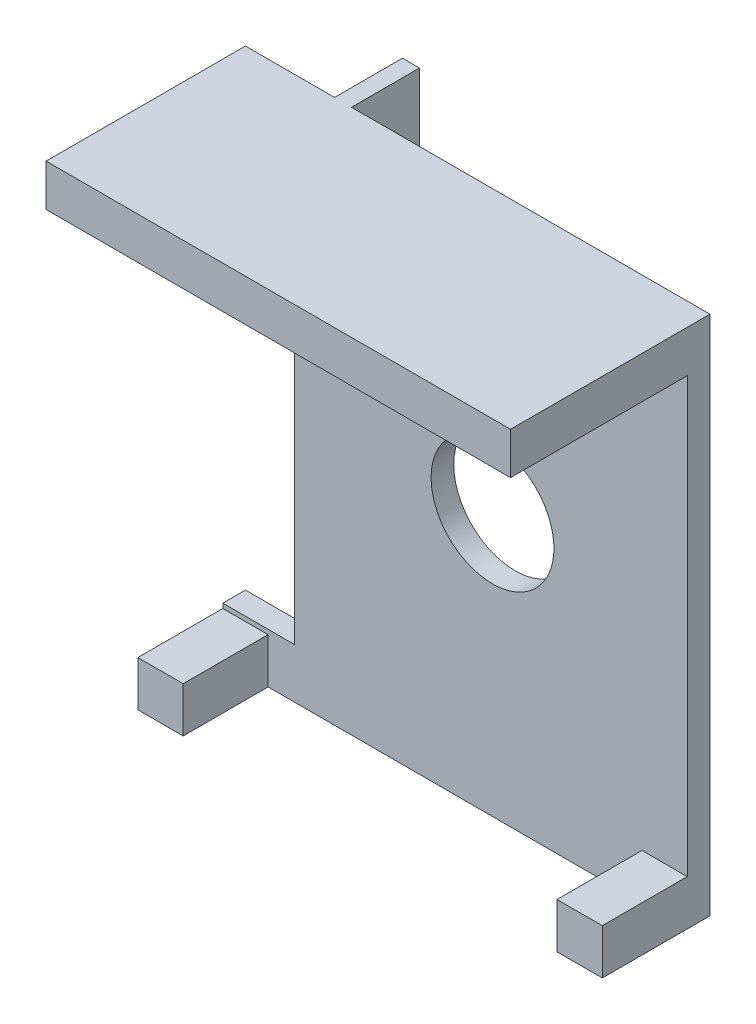
ISO-10303-21;
HEADER;
FILE_DESCRIPTION(('STEP AP214'),'2;1');
FILE_NAME('part.step','',(''),(''),'','','');
FILE_SCHEMA(('AUTOMOTIVE_DESIGN { 1 0 10303 214 1 1 1 1 }'));
ENDSEC;
DATA;
#1=APPLICATION_CONTEXT('core data for automotive mechanical design processes');
#2=APPLICATION_PROTOCOL_DEFINITION('international standard','automotive_design',2000,#1);
#3=PRODUCT_CONTEXT('',#1,'mechanical');
#4=PRODUCT('Part','Part','',(#3));
#5=PRODUCT_RELATED_PRODUCT_CATEGORY('part','',(#4));
#6=PRODUCT_DEFINITION_FORMATION('','',#4);
#7=PRODUCT_DEFINITION_CONTEXT('part definition',#1,'design');
#8=PRODUCT_DEFINITION('design','',#6,#7);
#9=PRODUCT_DEFINITION_SHAPE('','',#8);
#10=(LENGTH_UNIT() NAMED_UNIT(*) SI_UNIT(.MILLI.,.METRE.));
#11=(NAMED_UNIT(*) PLANE_ANGLE_UNIT() SI_UNIT($,.RADIAN.));
#12=(NAMED_UNIT(*) SI_UNIT($,.STERADIAN.) SOLID_ANGLE_UNIT());
#13=UNCERTAINTY_MEASURE_WITH_UNIT(LENGTH_MEASURE(1.E-05),#10,'distance_accuracy_value','');
#14=(GEOMETRIC_REPRESENTATION_CONTEXT(3) GLOBAL_UNCERTAINTY_ASSIGNED_CONTEXT((#13)) GLOBAL_UNIT_ASSIGNED_CONTEXT((#10,
#11,#12)) REPRESENTATION_CONTEXT('',''));
#15=CARTESIAN_POINT('',(0.,0.,0.));
#16=DIRECTION('',(0.,0.,1.));
#17=DIRECTION('',(1.,0.,0.));
#18=AXIS2_PLACEMENT_3D('',#15,#16,#17);
#19=CARTESIAN_POINT('',(0.,0.,2.));
#20=DIRECTION('',(1.,0.,0.));
#21=DIRECTION('',(0.,0.,-1.));
#22=AXIS2_PLACEMENT_3D('',#19,#20,#21);
#23=PLANE('',#22);
#24=DIRECTION('',(0.,-1.,0.));
#25=VECTOR('',#24,1.);
#26=CARTESIAN_POINT('',(0.,0.,2.));
#27=LINE('',#26,#25);
#28=CARTESIAN_POINT('',(0.,4.4080337669324,2.));
#29=VERTEX_POINT('',#28);
#30=CARTESIAN_POINT('',(0.,4.,2.));
#31=VERTEX_POINT('',#30);
#32=EDGE_CURVE('E343',#29,#31,#27,.T.);
#33=ORIENTED_EDGE('',*,*,#32,.F.);
#34=DIRECTION('',(0.,0.,-1.));
#35=VECTOR('',#34,1.);
#36=CARTESIAN_POINT('',(0.,4.4080337669324,2.));
#37=LINE('',#36,#35);
#38=CARTESIAN_POINT('',(0.,4.4080337669324,0.));
#39=VERTEX_POINT('',#38);
#40=EDGE_CURVE('E231',#29,#39,#37,.T.);
#41=ORIENTED_EDGE('',*,*,#40,.T.);
#42=DIRECTION('',(0.,-1.,0.));
#43=VECTOR('',#42,1.);
#44=CARTESIAN_POINT('',(0.,0.,0.));
#45=LINE('',#44,#43);
#46=CARTESIAN_POINT('',(0.,0.,0.));
#47=VERTEX_POINT('',#46);
#48=EDGE_CURVE('E337',#39,#47,#45,.T.);
#49=ORIENTED_EDGE('',*,*,#48,.T.);
#50=DIRECTION('',(0.,0.,-1.));
#51=VECTOR('',#50,1.);
#52=CARTESIAN_POINT('',(0.,0.,2.));
#53=LINE('',#52,#51);
#54=CARTESIAN_POINT('',(0.,0.,9.5));
#55=VERTEX_POINT('',#54);
#56=EDGE_CURVE('E11',#55,#47,#53,.T.);
#57=ORIENTED_EDGE('',*,*,#56,.F.);
#58=DIRECTION('',(0.,-1.,0.));
#59=VECTOR('',#58,1.);
#60=CARTESIAN_POINT('',(0.,0.,9.5));
#61=LINE('',#60,#59);
#62=CARTESIAN_POINT('',(0.,4.,9.5));
#63=VERTEX_POINT('',#62);
#64=EDGE_CURVE('E305',#63,#55,#61,.T.);
#65=ORIENTED_EDGE('',*,*,#64,.F.);
#66=DIRECTION('',(0.,0.,-1.));
#67=VECTOR('',#66,1.);
#68=CARTESIAN_POINT('',(0.,4.,9.5));
#69=LINE('',#68,#67);
#70=EDGE_CURVE('E319',#63,#31,#69,.T.);
#71=ORIENTED_EDGE('',*,*,#70,.T.);
#72=EDGE_LOOP('',(#33,#41,#49,#57,#65,#71));
#73=FACE_BOUND('',#72,.T.);
#74=ADVANCED_FACE('F38',(#73),#23,.F.);
#75=CARTESIAN_POINT('',(0.,0.,2.));
#76=DIRECTION('',(0.,0.,-1.));
#77=DIRECTION('',(-1.,0.,0.));
#78=AXIS2_PLACEMENT_3D('',#75,#76,#77);
#79=PLANE('',#78);
#80=CARTESIAN_POINT('',(23.8073986,23.20549075,2.));
#81=DIRECTION('',(0.,0.,-1.));
#82=DIRECTION('',(-1.,0.,0.));
#83=AXIS2_PLACEMENT_3D('',#80,#81,#82);
#84=CIRCLE('',#83,5.42197310937778);
#85=CARTESIAN_POINT('',(18.3854254906222,23.20549075,2.));
#86=VERTEX_POINT('',#85);
#87=EDGE_CURVE('E399',#86,#86,#84,.T.);
#88=ORIENTED_EDGE('',*,*,#87,.T.);
#89=EDGE_LOOP('',(#88));
#90=FACE_BOUND('',#89,.T.);
#91=DIRECTION('',(0.,-1.,0.));
#92=VECTOR('',#91,1.);
#93=CARTESIAN_POINT('',(6.31568334551957,38.749493626522,2.));
#94=LINE('',#93,#92);
#95=CARTESIAN_POINT('',(6.31568334551957,38.749493626522,2.));
#96=VERTEX_POINT('',#95);
#97=CARTESIAN_POINT('',(6.31568334551957,4.4080337669324,2.));
#98=VERTEX_POINT('',#97);
#99=EDGE_CURVE('E216',#96,#98,#94,.T.);
#100=ORIENTED_EDGE('',*,*,#99,.T.);
#101=DIRECTION('',(-1.,0.,0.));
#102=VECTOR('',#101,1.);
#103=CARTESIAN_POINT('',(0.,4.4080337669324,2.));
#104=LINE('',#103,#102);
#105=EDGE_CURVE('E221',#98,#29,#104,.T.);
#106=ORIENTED_EDGE('',*,*,#105,.T.);
#107=ORIENTED_EDGE('',*,*,#32,.T.);
#108=DIRECTION('',(-1.,0.,0.));
#109=VECTOR('',#108,1.);
#110=CARTESIAN_POINT('',(0.,4.,2.));
#111=LINE('',#110,#109);
#112=CARTESIAN_POINT('',(4.,4.,2.));
#113=VERTEX_POINT('',#112);
#114=EDGE_CURVE('E310',#113,#31,#111,.T.);
#115=ORIENTED_EDGE('',*,*,#114,.F.);
#116=DIRECTION('',(0.,1.,0.));
#117=VECTOR('',#116,1.);
#118=CARTESIAN_POINT('',(4.,0.,2.));
#119=LINE('',#118,#117);
#120=CARTESIAN_POINT('',(4.,0.,2.));
#121=VERTEX_POINT('',#120);
#122=EDGE_CURVE('E304',#121,#113,#119,.T.);
#123=ORIENTED_EDGE('',*,*,#122,.F.);
#124=DIRECTION('',(1.,0.,0.));
#125=VECTOR('',#124,1.);
#126=CARTESIAN_POINT('',(0.,0.,2.));
#127=LINE('',#126,#125);
#128=CARTESIAN_POINT('',(37.,0.,2.));
#129=VERTEX_POINT('',#128);
#130=EDGE_CURVE('E342',#121,#129,#127,.T.);
#131=ORIENTED_EDGE('',*,*,#130,.T.);
#132=DIRECTION('',(0.,-1.,0.));
#133=VECTOR('',#132,1.);
#134=CARTESIAN_POINT('',(37.,0.,2.));
#135=LINE('',#134,#133);
#136=CARTESIAN_POINT('',(37.,4.,2.));
#137=VERTEX_POINT('',#136);
#138=EDGE_CURVE('E276',#137,#129,#135,.T.);
#139=ORIENTED_EDGE('',*,*,#138,.F.);
#140=DIRECTION('',(-1.,0.,0.));
#141=VECTOR('',#140,1.);
#142=CARTESIAN_POINT('',(41.,4.,2.));
#143=LINE('',#142,#141);
#144=CARTESIAN_POINT('',(41.,4.,2.));
#145=VERTEX_POINT('',#144);
#146=EDGE_CURVE('E270',#145,#137,#143,.T.);
#147=ORIENTED_EDGE('',*,*,#146,.F.);
#148=DIRECTION('',(0.,1.,0.));
#149=VECTOR('',#148,1.);
#150=CARTESIAN_POINT('',(41.,0.,2.));
#151=LINE('',#150,#149);
#152=CARTESIAN_POINT('',(41.,42.3,2.));
#153=VERTEX_POINT('',#152);
#154=EDGE_CURVE('E346',#145,#153,#151,.T.);
#155=ORIENTED_EDGE('',*,*,#154,.T.);
#156=DIRECTION('',(1.,0.,0.));
#157=VECTOR('',#156,1.);
#158=CARTESIAN_POINT('',(0.,42.3,2.));
#159=LINE('',#158,#157);
#160=CARTESIAN_POINT('',(0.,42.3,2.));
#161=VERTEX_POINT('',#160);
#162=EDGE_CURVE('E235',#161,#153,#159,.T.);
#163=ORIENTED_EDGE('',*,*,#162,.F.);
#164=CARTESIAN_POINT('',(0.,38.749493626522,2.));
#165=VERTEX_POINT('',#164);
#166=EDGE_CURVE('E338',#161,#165,#27,.T.);
#167=ORIENTED_EDGE('',*,*,#166,.T.);
#168=DIRECTION('',(1.,0.,0.));
#169=VECTOR('',#168,1.);
#170=CARTESIAN_POINT('',(0.,38.749493626522,2.));
#171=LINE('',#170,#169);
#172=EDGE_CURVE('E212',#165,#96,#171,.T.);
#173=ORIENTED_EDGE('',*,*,#172,.T.);
#174=EDGE_LOOP('',(#100,#106,#107,#115,#123,#131,#139,#147,#155,#163,#167,#173));
#175=FACE_BOUND('',#174,.T.);
#176=ADVANCED_FACE('F411',(#90,#175),#79,.F.);
#177=CARTESIAN_POINT('',(0.,46.,0.));
#178=VERTEX_POINT('',#177);
#179=CARTESIAN_POINT('',(0.,38.749493626522,0.));
#180=VERTEX_POINT('',#179);
#181=EDGE_CURVE('E350',#178,#180,#45,.T.);
#182=ORIENTED_EDGE('',*,*,#181,.T.);
#183=DIRECTION('',(0.,0.,-1.));
#184=VECTOR('',#183,1.);
#185=CARTESIAN_POINT('',(0.,38.749493626522,2.));
#186=LINE('',#185,#184);
#187=EDGE_CURVE('E224',#165,#180,#186,.T.);
#188=ORIENTED_EDGE('',*,*,#187,.F.);
#189=ORIENTED_EDGE('',*,*,#166,.F.);
#190=DIRECTION('',(0.,0.,-1.));
#191=VECTOR('',#190,1.);
#192=CARTESIAN_POINT('',(0.,42.3,17.6));
#193=LINE('',#192,#191);
#194=CARTESIAN_POINT('',(0.,42.3,17.6));
#195=VERTEX_POINT('',#194);
#196=EDGE_CURVE('E266',#195,#161,#193,.T.);
#197=ORIENTED_EDGE('',*,*,#196,.F.);
#198=DIRECTION('',(0.,-1.,0.));
#199=VECTOR('',#198,1.);
#200=CARTESIAN_POINT('',(0.,46.,17.6));
#201=LINE('',#200,#199);
#202=CARTESIAN_POINT('',(0.,46.,17.6));
#203=VERTEX_POINT('',#202);
#204=EDGE_CURVE('E244',#203,#195,#201,.T.);
#205=ORIENTED_EDGE('',*,*,#204,.F.);
#206=DIRECTION('',(0.,0.,-1.));
#207=VECTOR('',#206,1.);
#208=CARTESIAN_POINT('',(0.,46.,2.));
#209=LINE('',#208,#207);
#210=EDGE_CURVE('E349',#203,#178,#209,.T.);
#211=ORIENTED_EDGE('',*,*,#210,.T.);
#212=EDGE_LOOP('',(#182,#188,#189,#197,#205,#211));
#213=FACE_BOUND('',#212,.T.);
#214=ADVANCED_FACE('F40',(#213),#23,.F.);
#215=CARTESIAN_POINT('',(0.,0.,2.));
#216=DIRECTION('',(0.,1.,0.));
#217=DIRECTION('',(0.,0.,1.));
#218=AXIS2_PLACEMENT_3D('',#215,#216,#217);
#219=PLANE('',#218);
#220=DIRECTION('',(1.,0.,0.));
#221=VECTOR('',#220,1.);
#222=CARTESIAN_POINT('',(0.,0.,0.));
#223=LINE('',#222,#221);
#224=CARTESIAN_POINT('',(41.,0.,0.));
#225=VERTEX_POINT('',#224);
#226=EDGE_CURVE('E354',#47,#225,#223,.T.);
#227=ORIENTED_EDGE('',*,*,#226,.T.);
#228=DIRECTION('',(0.,0.,-1.));
#229=VECTOR('',#228,1.);
#230=CARTESIAN_POINT('',(41.,0.,2.));
#231=LINE('',#230,#229);
#232=CARTESIAN_POINT('',(41.,0.,9.5));
#233=VERTEX_POINT('',#232);
#234=EDGE_CURVE('E47',#233,#225,#231,.T.);
#235=ORIENTED_EDGE('',*,*,#234,.F.);
#236=DIRECTION('',(1.,0.,0.));
#237=VECTOR('',#236,1.);
#238=CARTESIAN_POINT('',(41.,0.,9.5));
#239=LINE('',#238,#237);
#240=CARTESIAN_POINT('',(37.,0.,9.5));
#241=VERTEX_POINT('',#240);
#242=EDGE_CURVE('E282',#241,#233,#239,.T.);
#243=ORIENTED_EDGE('',*,*,#242,.F.);
#244=DIRECTION('',(0.,0.,-1.));
#245=VECTOR('',#244,1.);
#246=CARTESIAN_POINT('',(37.,0.,9.5));
#247=LINE('',#246,#245);
#248=EDGE_CURVE('E286',#241,#129,#247,.T.);
#249=ORIENTED_EDGE('',*,*,#248,.T.);
#250=ORIENTED_EDGE('',*,*,#130,.F.);
#251=DIRECTION('',(0.,0.,-1.));
#252=VECTOR('',#251,1.);
#253=CARTESIAN_POINT('',(4.,0.,9.5));
#254=LINE('',#253,#252);
#255=CARTESIAN_POINT('',(4.,0.,9.5));
#256=VERTEX_POINT('',#255);
#257=EDGE_CURVE('E333',#256,#121,#254,.T.);
#258=ORIENTED_EDGE('',*,*,#257,.F.);
#259=DIRECTION('',(1.,0.,0.));
#260=VECTOR('',#259,1.);
#261=CARTESIAN_POINT('',(0.,0.,9.5));
#262=LINE('',#261,#260);
#263=EDGE_CURVE('E309',#55,#256,#262,.T.);
#264=ORIENTED_EDGE('',*,*,#263,.F.);
#265=ORIENTED_EDGE('',*,*,#56,.T.);
#266=EDGE_LOOP('',(#227,#235,#243,#249,#250,#258,#264,#265));
#267=FACE_BOUND('',#266,.T.);
#268=ADVANCED_FACE('F441',(#267),#219,.F.);
#269=CARTESIAN_POINT('',(41.,0.,2.));
#270=DIRECTION('',(-1.,0.,0.));
#271=DIRECTION('',(0.,0.,1.));
#272=AXIS2_PLACEMENT_3D('',#269,#270,#271);
#273=PLANE('',#272);
#274=DIRECTION('',(0.,1.,0.));
#275=VECTOR('',#274,1.);
#276=CARTESIAN_POINT('',(41.,0.,0.));
#277=LINE('',#276,#275);
#278=CARTESIAN_POINT('',(41.,46.,0.));
#279=VERTEX_POINT('',#278);
#280=EDGE_CURVE('E357',#225,#279,#277,.T.);
#281=ORIENTED_EDGE('',*,*,#280,.T.);
#282=DIRECTION('',(0.,0.,-1.));
#283=VECTOR('',#282,1.);
#284=CARTESIAN_POINT('',(41.,46.,2.));
#285=LINE('',#284,#283);
#286=CARTESIAN_POINT('',(41.,46.,17.6));
#287=VERTEX_POINT('',#286);
#288=EDGE_CURVE('E367',#287,#279,#285,.T.);
#289=ORIENTED_EDGE('',*,*,#288,.F.);
#290=DIRECTION('',(0.,1.,0.));
#291=VECTOR('',#290,1.);
#292=CARTESIAN_POINT('',(41.,46.,17.6));
#293=LINE('',#292,#291);
#294=CARTESIAN_POINT('',(41.,42.3,17.6));
#295=VERTEX_POINT('',#294);
#296=EDGE_CURVE('E251',#295,#287,#293,.T.);
#297=ORIENTED_EDGE('',*,*,#296,.F.);
#298=DIRECTION('',(0.,0.,-1.));
#299=VECTOR('',#298,1.);
#300=CARTESIAN_POINT('',(41.,42.3,17.6));
#301=LINE('',#300,#299);
#302=EDGE_CURVE('E259',#295,#153,#301,.T.);
#303=ORIENTED_EDGE('',*,*,#302,.T.);
#304=ORIENTED_EDGE('',*,*,#154,.F.);
#305=DIRECTION('',(0.,0.,-1.));
#306=VECTOR('',#305,1.);
#307=CARTESIAN_POINT('',(41.,4.,9.5));
#308=LINE('',#307,#306);
#309=CARTESIAN_POINT('',(41.,4.,9.5));
#310=VERTEX_POINT('',#309);
#311=EDGE_CURVE('E300',#310,#145,#308,.T.);
#312=ORIENTED_EDGE('',*,*,#311,.F.);
#313=DIRECTION('',(0.,1.,0.));
#314=VECTOR('',#313,1.);
#315=CARTESIAN_POINT('',(41.,0.,9.5));
#316=LINE('',#315,#314);
#317=EDGE_CURVE('E271',#233,#310,#316,.T.);
#318=ORIENTED_EDGE('',*,*,#317,.F.);
#319=ORIENTED_EDGE('',*,*,#234,.T.);
#320=EDGE_LOOP('',(#281,#289,#297,#303,#304,#312,#318,#319));
#321=FACE_BOUND('',#320,.T.);
#322=ADVANCED_FACE('F375',(#321),#273,.F.);
#323=CARTESIAN_POINT('',(0.,46.,2.));
#324=DIRECTION('',(0.,-1.,0.));
#325=DIRECTION('',(0.,0.,-1.));
#326=AXIS2_PLACEMENT_3D('',#323,#324,#325);
#327=PLANE('',#326);
#328=DIRECTION('',(-1.,0.,0.));
#329=VECTOR('',#328,1.);
#330=CARTESIAN_POINT('',(0.,46.,0.));
#331=LINE('',#330,#329);
#332=CARTESIAN_POINT('',(9.36150105812317,46.,0.));
#333=VERTEX_POINT('',#332);
#334=EDGE_CURVE('E360',#279,#333,#331,.T.);
#335=ORIENTED_EDGE('',*,*,#334,.T.);
#336=DIRECTION('',(0.,0.,1.));
#337=VECTOR('',#336,1.);
#338=CARTESIAN_POINT('',(9.36150105812317,46.,-6.));
#339=LINE('',#338,#337);
#340=CARTESIAN_POINT('',(9.36150105812317,46.,-6.));
#341=VERTEX_POINT('',#340);
#342=EDGE_CURVE('E385',#341,#333,#339,.T.);
#343=ORIENTED_EDGE('',*,*,#342,.F.);
#344=DIRECTION('',(1.,0.,0.));
#345=VECTOR('',#344,1.);
#346=CARTESIAN_POINT('',(9.36150105812317,46.,-6.));
#347=LINE('',#346,#345);
#348=CARTESIAN_POINT('',(7.86150105812317,46.,-6.));
#349=VERTEX_POINT('',#348);
#350=EDGE_CURVE('E191',#349,#341,#347,.T.);
#351=ORIENTED_EDGE('',*,*,#350,.F.);
#352=DIRECTION('',(0.,0.,1.));
#353=VECTOR('',#352,1.);
#354=CARTESIAN_POINT('',(7.86150105812317,46.,-6.));
#355=LINE('',#354,#353);
#356=CARTESIAN_POINT('',(7.86150105812317,46.,0.));
#357=VERTEX_POINT('',#356);
#358=EDGE_CURVE('E208',#349,#357,#355,.T.);
#359=ORIENTED_EDGE('',*,*,#358,.T.);
#360=EDGE_CURVE('E60',#357,#178,#331,.T.);
#361=ORIENTED_EDGE('',*,*,#360,.T.);
#362=ORIENTED_EDGE('',*,*,#210,.F.);
#363=DIRECTION('',(-1.,0.,0.));
#364=VECTOR('',#363,1.);
#365=CARTESIAN_POINT('',(0.,46.,17.6));
#366=LINE('',#365,#364);
#367=EDGE_CURVE('E255',#287,#203,#366,.T.);
#368=ORIENTED_EDGE('',*,*,#367,.F.);
#369=ORIENTED_EDGE('',*,*,#288,.T.);
#370=EDGE_LOOP('',(#335,#343,#351,#359,#361,#362,#368,#369));
#371=FACE_BOUND('',#370,.T.);
#372=ADVANCED_FACE('F384',(#371),#327,.F.);
#373=CARTESIAN_POINT('',(0.,0.,0.));
#374=DIRECTION('',(0.,0.,-1.));
#375=DIRECTION('',(-1.,0.,0.));
#376=AXIS2_PLACEMENT_3D('',#373,#374,#375);
#377=PLANE('',#376);
#378=CARTESIAN_POINT('',(23.8073986,23.20549075,0.));
#379=DIRECTION('',(0.,0.,-1.));
#380=DIRECTION('',(-1.,0.,0.));
#381=AXIS2_PLACEMENT_3D('',#378,#379,#380);
#382=CIRCLE('',#381,5.42197310937778);
#383=CARTESIAN_POINT('',(18.3854254906222,23.20549075,0.));
#384=VERTEX_POINT('',#383);
#385=EDGE_CURVE('E403',#384,#384,#382,.T.);
#386=ORIENTED_EDGE('',*,*,#385,.F.);
#387=EDGE_LOOP('',(#386));
#388=FACE_BOUND('',#387,.T.);
#389=DIRECTION('',(0.,-1.,0.));
#390=VECTOR('',#389,1.);
#391=CARTESIAN_POINT('',(9.36150105812317,46.,0.));
#392=LINE('',#391,#390);
#393=CARTESIAN_POINT('',(9.36150105812317,32.,0.));
#394=VERTEX_POINT('',#393);
#395=EDGE_CURVE('E199',#333,#394,#392,.T.);
#396=ORIENTED_EDGE('',*,*,#395,.F.);
#397=ORIENTED_EDGE('',*,*,#334,.F.);
#398=ORIENTED_EDGE('',*,*,#280,.F.);
#399=ORIENTED_EDGE('',*,*,#226,.F.);
#400=ORIENTED_EDGE('',*,*,#48,.F.);
#401=DIRECTION('',(-1.,0.,0.));
#402=VECTOR('',#401,1.);
#403=CARTESIAN_POINT('',(0.,4.4080337669324,0.));
#404=LINE('',#403,#402);
#405=CARTESIAN_POINT('',(6.31568334551957,4.4080337669324,0.));
#406=VERTEX_POINT('',#405);
#407=EDGE_CURVE('E217',#406,#39,#404,.T.);
#408=ORIENTED_EDGE('',*,*,#407,.F.);
#409=DIRECTION('',(0.,-1.,0.));
#410=VECTOR('',#409,1.);
#411=CARTESIAN_POINT('',(6.31568334551957,38.749493626522,0.));
#412=LINE('',#411,#410);
#413=CARTESIAN_POINT('',(6.31568334551957,38.749493626522,0.));
#414=VERTEX_POINT('',#413);
#415=EDGE_CURVE('E206',#414,#406,#412,.T.);
#416=ORIENTED_EDGE('',*,*,#415,.F.);
#417=DIRECTION('',(1.,0.,0.));
#418=VECTOR('',#417,1.);
#419=CARTESIAN_POINT('',(0.,38.749493626522,0.));
#420=LINE('',#419,#418);
#421=EDGE_CURVE('E201',#180,#414,#420,.T.);
#422=ORIENTED_EDGE('',*,*,#421,.F.);
#423=ORIENTED_EDGE('',*,*,#181,.F.);
#424=ORIENTED_EDGE('',*,*,#360,.F.);
#425=DIRECTION('',(0.,1.,0.));
#426=VECTOR('',#425,1.);
#427=CARTESIAN_POINT('',(7.86150105812317,46.,0.));
#428=LINE('',#427,#426);
#429=CARTESIAN_POINT('',(7.86150105812317,32.,0.));
#430=VERTEX_POINT('',#429);
#431=EDGE_CURVE('E196',#430,#357,#428,.T.);
#432=ORIENTED_EDGE('',*,*,#431,.F.);
#433=DIRECTION('',(-1.,0.,0.));
#434=VECTOR('',#433,1.);
#435=CARTESIAN_POINT('',(9.36150105812317,32.,0.));
#436=LINE('',#435,#434);
#437=EDGE_CURVE('E54',#394,#430,#436,.T.);
#438=ORIENTED_EDGE('',*,*,#437,.F.);
#439=EDGE_LOOP('',(#396,#397,#398,#399,#400,#408,#416,#422,#423,#424,#432,#438));
#440=FACE_BOUND('',#439,.T.);
#441=ADVANCED_FACE('F381',(#388,#440),#377,.T.);
#442=CARTESIAN_POINT('',(4.,0.,9.5));
#443=DIRECTION('',(-1.,0.,0.));
#444=DIRECTION('',(0.,-1.,0.));
#445=AXIS2_PLACEMENT_3D('',#442,#443,#444);
#446=PLANE('',#445);
#447=ORIENTED_EDGE('',*,*,#122,.T.);
#448=DIRECTION('',(0.,0.,-1.));
#449=VECTOR('',#448,1.);
#450=CARTESIAN_POINT('',(4.,4.,9.5));
#451=LINE('',#450,#449);
#452=CARTESIAN_POINT('',(4.,4.,9.5));
#453=VERTEX_POINT('',#452);
#454=EDGE_CURVE('E329',#453,#113,#451,.T.);
#455=ORIENTED_EDGE('',*,*,#454,.F.);
#456=DIRECTION('',(0.,1.,0.));
#457=VECTOR('',#456,1.);
#458=CARTESIAN_POINT('',(4.,0.,9.5));
#459=LINE('',#458,#457);
#460=EDGE_CURVE('E313',#256,#453,#459,.T.);
#461=ORIENTED_EDGE('',*,*,#460,.F.);
#462=ORIENTED_EDGE('',*,*,#257,.T.);
#463=EDGE_LOOP('',(#447,#455,#461,#462));
#464=FACE_BOUND('',#463,.T.);
#465=ADVANCED_FACE('F421',(#464),#446,.F.);
#466=CARTESIAN_POINT('',(0.,4.,9.5));
#467=DIRECTION('',(0.,-1.,0.));
#468=DIRECTION('',(0.,0.,-1.));
#469=AXIS2_PLACEMENT_3D('',#466,#467,#468);
#470=PLANE('',#469);
#471=ORIENTED_EDGE('',*,*,#114,.T.);
#472=ORIENTED_EDGE('',*,*,#70,.F.);
#473=DIRECTION('',(-1.,0.,0.));
#474=VECTOR('',#473,1.);
#475=CARTESIAN_POINT('',(0.,4.,9.5));
#476=LINE('',#475,#474);
#477=EDGE_CURVE('E316',#453,#63,#476,.T.);
#478=ORIENTED_EDGE('',*,*,#477,.F.);
#479=ORIENTED_EDGE('',*,*,#454,.T.);
#480=EDGE_LOOP('',(#471,#472,#478,#479));
#481=FACE_BOUND('',#480,.T.);
#482=ADVANCED_FACE('F428',(#481),#470,.F.);
#483=CARTESIAN_POINT('',(0.,0.,9.5));
#484=DIRECTION('',(0.,0.,-1.));
#485=DIRECTION('',(-1.,0.,0.));
#486=AXIS2_PLACEMENT_3D('',#483,#484,#485);
#487=PLANE('',#486);
#488=ORIENTED_EDGE('',*,*,#64,.T.);
#489=ORIENTED_EDGE('',*,*,#263,.T.);
#490=ORIENTED_EDGE('',*,*,#460,.T.);
#491=ORIENTED_EDGE('',*,*,#477,.T.);
#492=EDGE_LOOP('',(#488,#489,#490,#491));
#493=FACE_BOUND('',#492,.T.);
#494=ADVANCED_FACE('F498',(#493),#487,.F.);
#495=CARTESIAN_POINT('',(41.,4.,9.5));
#496=DIRECTION('',(0.,-1.,0.));
#497=DIRECTION('',(1.,0.,0.));
#498=AXIS2_PLACEMENT_3D('',#495,#496,#497);
#499=PLANE('',#498);
#500=ORIENTED_EDGE('',*,*,#146,.T.);
#501=DIRECTION('',(0.,0.,-1.));
#502=VECTOR('',#501,1.);
#503=CARTESIAN_POINT('',(37.,4.,9.5));
#504=LINE('',#503,#502);
#505=CARTESIAN_POINT('',(37.,4.,9.5));
#506=VERTEX_POINT('',#505);
#507=EDGE_CURVE('E296',#506,#137,#504,.T.);
#508=ORIENTED_EDGE('',*,*,#507,.F.);
#509=DIRECTION('',(-1.,0.,0.));
#510=VECTOR('',#509,1.);
#511=CARTESIAN_POINT('',(41.,4.,9.5));
#512=LINE('',#511,#510);
#513=EDGE_CURVE('E275',#310,#506,#512,.T.);
#514=ORIENTED_EDGE('',*,*,#513,.F.);
#515=ORIENTED_EDGE('',*,*,#311,.T.);
#516=EDGE_LOOP('',(#500,#508,#514,#515));
#517=FACE_BOUND('',#516,.T.);
#518=ADVANCED_FACE('F494',(#517),#499,.F.);
#519=CARTESIAN_POINT('',(37.,0.,9.5));
#520=DIRECTION('',(1.,0.,0.));
#521=DIRECTION('',(0.,0.,-1.));
#522=AXIS2_PLACEMENT_3D('',#519,#520,#521);
#523=PLANE('',#522);
#524=ORIENTED_EDGE('',*,*,#138,.T.);
#525=ORIENTED_EDGE('',*,*,#248,.F.);
#526=DIRECTION('',(0.,-1.,0.));
#527=VECTOR('',#526,1.);
#528=CARTESIAN_POINT('',(37.,0.,9.5));
#529=LINE('',#528,#527);
#530=EDGE_CURVE('E279',#506,#241,#529,.T.);
#531=ORIENTED_EDGE('',*,*,#530,.F.);
#532=ORIENTED_EDGE('',*,*,#507,.T.);
#533=EDGE_LOOP('',(#524,#525,#531,#532));
#534=FACE_BOUND('',#533,.T.);
#535=ADVANCED_FACE('F490',(#534),#523,.F.);
#536=CARTESIAN_POINT('',(0.,0.,9.5));
#537=DIRECTION('',(0.,0.,1.));
#538=DIRECTION('',(1.,0.,0.));
#539=AXIS2_PLACEMENT_3D('',#536,#537,#538);
#540=PLANE('',#539);
#541=ORIENTED_EDGE('',*,*,#317,.T.);
#542=ORIENTED_EDGE('',*,*,#513,.T.);
#543=ORIENTED_EDGE('',*,*,#530,.T.);
#544=ORIENTED_EDGE('',*,*,#242,.T.);
#545=EDGE_LOOP('',(#541,#542,#543,#544));
#546=FACE_BOUND('',#545,.T.);
#547=ADVANCED_FACE('F487',(#546),#540,.T.);
#548=CARTESIAN_POINT('',(0.,42.3,17.6));
#549=DIRECTION('',(0.,1.,0.));
#550=DIRECTION('',(-1.,0.,0.));
#551=AXIS2_PLACEMENT_3D('',#548,#549,#550);
#552=PLANE('',#551);
#553=ORIENTED_EDGE('',*,*,#162,.T.);
#554=ORIENTED_EDGE('',*,*,#302,.F.);
#555=DIRECTION('',(1.,0.,0.));
#556=VECTOR('',#555,1.);
#557=CARTESIAN_POINT('',(0.,42.3,17.6));
#558=LINE('',#557,#556);
#559=EDGE_CURVE('E248',#195,#295,#558,.T.);
#560=ORIENTED_EDGE('',*,*,#559,.F.);
#561=ORIENTED_EDGE('',*,*,#196,.T.);
#562=EDGE_LOOP('',(#553,#554,#560,#561));
#563=FACE_BOUND('',#562,.T.);
#564=ADVANCED_FACE('F457',(#563),#552,.F.);
#565=CARTESIAN_POINT('',(0.,0.,17.6));
#566=DIRECTION('',(0.,0.,1.));
#567=DIRECTION('',(1.,0.,0.));
#568=AXIS2_PLACEMENT_3D('',#565,#566,#567);
#569=PLANE('',#568);
#570=ORIENTED_EDGE('',*,*,#204,.T.);
#571=ORIENTED_EDGE('',*,*,#559,.T.);
#572=ORIENTED_EDGE('',*,*,#296,.T.);
#573=ORIENTED_EDGE('',*,*,#367,.T.);
#574=EDGE_LOOP('',(#570,#571,#572,#573));
#575=FACE_BOUND('',#574,.T.);
#576=ADVANCED_FACE('F461',(#575),#569,.T.);
#577=CARTESIAN_POINT('',(0.,4.4080337669324,2.));
#578=DIRECTION('',(0.,-1.,0.));
#579=DIRECTION('',(1.,0.,0.));
#580=AXIS2_PLACEMENT_3D('',#577,#578,#579);
#581=PLANE('',#580);
#582=ORIENTED_EDGE('',*,*,#407,.T.);
#583=ORIENTED_EDGE('',*,*,#40,.F.);
#584=ORIENTED_EDGE('',*,*,#105,.F.);
#585=DIRECTION('',(0.,0.,-1.));
#586=VECTOR('',#585,1.);
#587=CARTESIAN_POINT('',(6.31568334551957,4.4080337669324,2.));
#588=LINE('',#587,#586);
#589=EDGE_CURVE('E236',#98,#406,#588,.T.);
#590=ORIENTED_EDGE('',*,*,#589,.T.);
#591=EDGE_LOOP('',(#582,#583,#584,#590));
#592=FACE_BOUND('',#591,.T.);
#593=ADVANCED_FACE('F469',(#592),#581,.F.);
#594=CARTESIAN_POINT('',(6.31568334551957,38.749493626522,2.));
#595=DIRECTION('',(1.,0.,0.));
#596=DIRECTION('',(0.,0.,-1.));
#597=AXIS2_PLACEMENT_3D('',#594,#595,#596);
#598=PLANE('',#597);
#599=ORIENTED_EDGE('',*,*,#415,.T.);
#600=ORIENTED_EDGE('',*,*,#589,.F.);
#601=ORIENTED_EDGE('',*,*,#99,.F.);
#602=DIRECTION('',(0.,0.,-1.));
#603=VECTOR('',#602,1.);
#604=CARTESIAN_POINT('',(6.31568334551957,38.749493626522,2.));
#605=LINE('',#604,#603);
#606=EDGE_CURVE('E239',#96,#414,#605,.T.);
#607=ORIENTED_EDGE('',*,*,#606,.T.);
#608=EDGE_LOOP('',(#599,#600,#601,#607));
#609=FACE_BOUND('',#608,.T.);
#610=ADVANCED_FACE('F472',(#609),#598,.F.);
#611=CARTESIAN_POINT('',(0.,38.749493626522,2.));
#612=DIRECTION('',(0.,1.,0.));
#613=DIRECTION('',(0.,0.,1.));
#614=AXIS2_PLACEMENT_3D('',#611,#612,#613);
#615=PLANE('',#614);
#616=ORIENTED_EDGE('',*,*,#421,.T.);
#617=ORIENTED_EDGE('',*,*,#606,.F.);
#618=ORIENTED_EDGE('',*,*,#172,.F.);
#619=ORIENTED_EDGE('',*,*,#187,.T.);
#620=EDGE_LOOP('',(#616,#617,#618,#619));
#621=FACE_BOUND('',#620,.T.);
#622=ADVANCED_FACE('F453',(#621),#615,.F.);
#623=CARTESIAN_POINT('',(9.36150105812317,46.,-6.));
#624=DIRECTION('',(-1.,0.,0.));
#625=DIRECTION('',(0.,-1.,0.));
#626=AXIS2_PLACEMENT_3D('',#623,#624,#625);
#627=PLANE('',#626);
#628=ORIENTED_EDGE('',*,*,#395,.T.);
#629=DIRECTION('',(0.,0.,1.));
#630=VECTOR('',#629,1.);
#631=CARTESIAN_POINT('',(9.36150105812317,32.,-6.));
#632=LINE('',#631,#630);
#633=CARTESIAN_POINT('',(9.36150105812317,32.,-6.));
#634=VERTEX_POINT('',#633);
#635=EDGE_CURVE('E178',#634,#394,#632,.T.);
#636=ORIENTED_EDGE('',*,*,#635,.F.);
#637=DIRECTION('',(0.,-1.,0.));
#638=VECTOR('',#637,1.);
#639=CARTESIAN_POINT('',(9.36150105812317,46.,-6.));
#640=LINE('',#639,#638);
#641=EDGE_CURVE('E186',#341,#634,#640,.T.);
#642=ORIENTED_EDGE('',*,*,#641,.F.);
#643=ORIENTED_EDGE('',*,*,#342,.T.);
#644=EDGE_LOOP('',(#628,#636,#642,#643));
#645=FACE_BOUND('',#644,.T.);
#646=ADVANCED_FACE('F198',(#645),#627,.F.);
#647=CARTESIAN_POINT('',(9.36150105812317,32.,-6.));
#648=DIRECTION('',(0.,1.,0.));
#649=DIRECTION('',(0.,0.,1.));
#650=AXIS2_PLACEMENT_3D('',#647,#648,#649);
#651=PLANE('',#650);
#652=ORIENTED_EDGE('',*,*,#437,.T.);
#653=DIRECTION('',(0.,0.,1.));
#654=VECTOR('',#653,1.);
#655=CARTESIAN_POINT('',(7.86150105812317,32.,-6.));
#656=LINE('',#655,#654);
#657=CARTESIAN_POINT('',(7.86150105812317,32.,-6.));
#658=VERTEX_POINT('',#657);
#659=EDGE_CURVE('E181',#658,#430,#656,.T.);
#660=ORIENTED_EDGE('',*,*,#659,.F.);
#661=DIRECTION('',(-1.,0.,0.));
#662=VECTOR('',#661,1.);
#663=CARTESIAN_POINT('',(9.36150105812317,32.,-6.));
#664=LINE('',#663,#662);
#665=EDGE_CURVE('E174',#634,#658,#664,.T.);
#666=ORIENTED_EDGE('',*,*,#665,.F.);
#667=ORIENTED_EDGE('',*,*,#635,.T.);
#668=EDGE_LOOP('',(#652,#660,#666,#667));
#669=FACE_BOUND('',#668,.T.);
#670=ADVANCED_FACE('F176',(#669),#651,.F.);
#671=CARTESIAN_POINT('',(7.86150105812317,46.,-6.));
#672=DIRECTION('',(1.,0.,0.));
#673=DIRECTION('',(0.,1.,0.));
#674=AXIS2_PLACEMENT_3D('',#671,#672,#673);
#675=PLANE('',#674);
#676=ORIENTED_EDGE('',*,*,#431,.T.);
#677=ORIENTED_EDGE('',*,*,#358,.F.);
#678=DIRECTION('',(0.,1.,0.));
#679=VECTOR('',#678,1.);
#680=CARTESIAN_POINT('',(7.86150105812317,46.,-6.));
#681=LINE('',#680,#679);
#682=EDGE_CURVE('E185',#658,#349,#681,.T.);
#683=ORIENTED_EDGE('',*,*,#682,.F.);
#684=ORIENTED_EDGE('',*,*,#659,.T.);
#685=EDGE_LOOP('',(#676,#677,#683,#684));
#686=FACE_BOUND('',#685,.T.);
#687=ADVANCED_FACE('F585',(#686),#675,.F.);
#688=CARTESIAN_POINT('',(0.,0.,-6.));
#689=DIRECTION('',(0.,0.,-1.));
#690=DIRECTION('',(-1.,0.,0.));
#691=AXIS2_PLACEMENT_3D('',#688,#689,#690);
#692=PLANE('',#691);
#693=ORIENTED_EDGE('',*,*,#641,.T.);
#694=ORIENTED_EDGE('',*,*,#665,.T.);
#695=ORIENTED_EDGE('',*,*,#682,.T.);
#696=ORIENTED_EDGE('',*,*,#350,.T.);
#697=EDGE_LOOP('',(#693,#694,#695,#696));
#698=FACE_BOUND('',#697,.T.);
#699=ADVANCED_FACE('F189',(#698),#692,.T.);
#700=CARTESIAN_POINT('',(23.8073986,23.20549075,2.));
#701=DIRECTION('',(0.,0.,-1.));
#702=DIRECTION('',(-1.,0.,0.));
#703=AXIS2_PLACEMENT_3D('',#700,#701,#702);
#704=CYLINDRICAL_SURFACE('',#703,5.42197310937778);
#705=ORIENTED_EDGE('',*,*,#87,.F.);
#706=EDGE_LOOP('',(#705));
#707=FACE_BOUND('',#706,.T.);
#708=ORIENTED_EDGE('',*,*,#385,.T.);
#709=EDGE_LOOP('',(#708));
#710=FACE_BOUND('',#709,.T.);
#711=ADVANCED_FACE('F414',(#707,#710),#704,.F.);
#712=CLOSED_SHELL('',(#74,#176,#214,#268,#322,#372,#441,#465,#482,#494,#518,#535,#547,#564,#576,
#593,#610,#622,#646,#670,#687,#699,#711));
#713=MANIFOLD_SOLID_BREP('B2',#712);
#714=ADVANCED_BREP_SHAPE_REPRESENTATION('',(#18,#713),#14);
#715=SHAPE_DEFINITION_REPRESENTATION(#9,#714);
ENDSEC;
END-ISO-10303-21;
